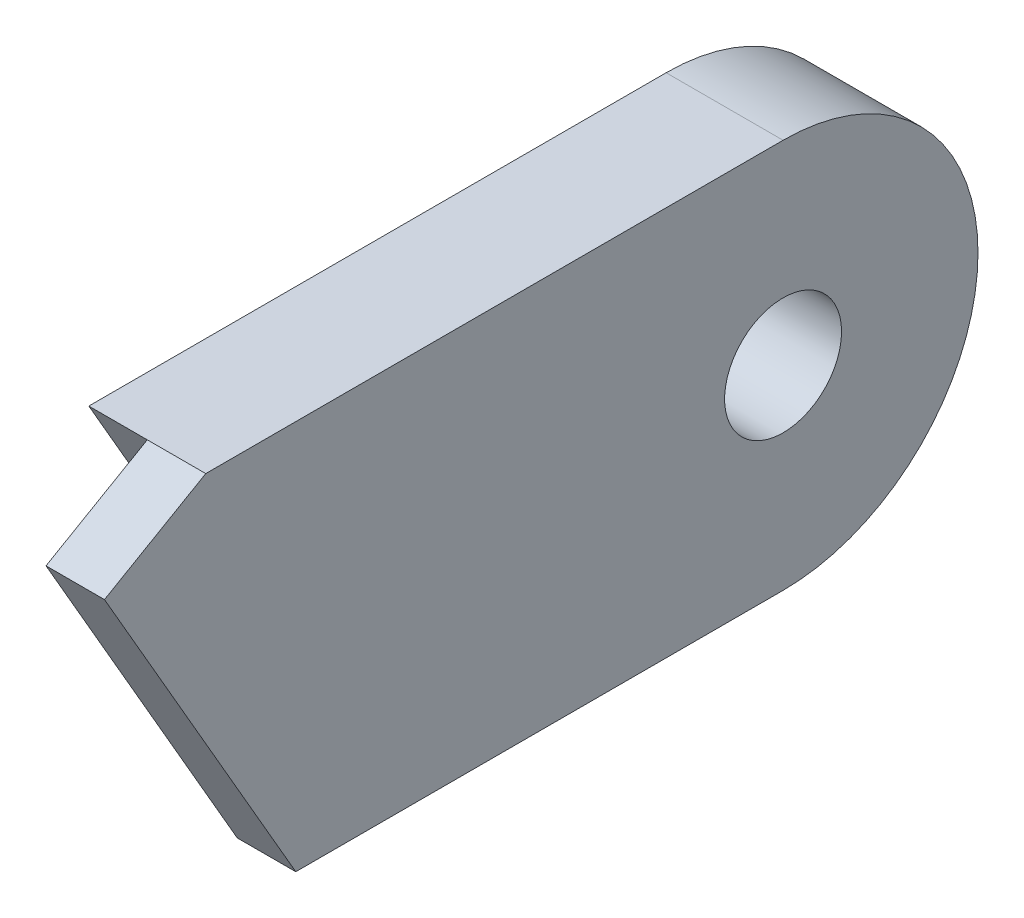
ISO-10303-21;
HEADER;
FILE_DESCRIPTION(('STEP AP214'),'2;1');
FILE_NAME('part.step','',(''),(''),'','','');
FILE_SCHEMA(('AUTOMOTIVE_DESIGN { 1 0 10303 214 1 1 1 1 }'));
ENDSEC;
DATA;
#1=APPLICATION_CONTEXT('core data for automotive mechanical design processes');
#2=APPLICATION_PROTOCOL_DEFINITION('international standard','automotive_design',2000,#1);
#3=PRODUCT_CONTEXT('',#1,'mechanical');
#4=PRODUCT('Part','Part','',(#3));
#5=PRODUCT_RELATED_PRODUCT_CATEGORY('part','',(#4));
#6=PRODUCT_DEFINITION_FORMATION('','',#4);
#7=PRODUCT_DEFINITION_CONTEXT('part definition',#1,'design');
#8=PRODUCT_DEFINITION('design','',#6,#7);
#9=PRODUCT_DEFINITION_SHAPE('','',#8);
#10=(LENGTH_UNIT() NAMED_UNIT(*) SI_UNIT(.MILLI.,.METRE.));
#11=(NAMED_UNIT(*) PLANE_ANGLE_UNIT() SI_UNIT($,.RADIAN.));
#12=(NAMED_UNIT(*) SI_UNIT($,.STERADIAN.) SOLID_ANGLE_UNIT());
#13=UNCERTAINTY_MEASURE_WITH_UNIT(LENGTH_MEASURE(1.E-05),#10,'distance_accuracy_value','');
#14=(GEOMETRIC_REPRESENTATION_CONTEXT(3) GLOBAL_UNCERTAINTY_ASSIGNED_CONTEXT((#13)) GLOBAL_UNIT_ASSIGNED_CONTEXT((#10,
#11,#12)) REPRESENTATION_CONTEXT('',''));
#15=CARTESIAN_POINT('',(0.,0.,0.));
#16=DIRECTION('',(0.,0.,1.));
#17=DIRECTION('',(1.,0.,0.));
#18=AXIS2_PLACEMENT_3D('',#15,#16,#17);
#19=CARTESIAN_POINT('',(6.,10.,-25.));
#20=DIRECTION('',(-1.,0.,0.));
#21=DIRECTION('',(0.,0.,1.));
#22=AXIS2_PLACEMENT_3D('',#19,#20,#21);
#23=PLANE('',#22);
#24=DIRECTION('',(0.,-0.866025403784436,-0.500000000000004));
#25=VECTOR('',#24,1.);
#26=CARTESIAN_POINT('',(6.,17.,9.81495457622374));
#27=LINE('',#26,#25);
#28=CARTESIAN_POINT('',(6.,17.,9.81495457622374));
#29=VERTEX_POINT('',#28);
#30=CARTESIAN_POINT('',(6.,0.,0.));
#31=VERTEX_POINT('',#30);
#32=EDGE_CURVE('E115',#29,#31,#27,.T.);
#33=ORIENTED_EDGE('',*,*,#32,.T.);
#34=DIRECTION('',(0.,0.,-1.));
#35=VECTOR('',#34,1.);
#36=CARTESIAN_POINT('',(6.,0.,-25.));
#37=LINE('',#36,#35);
#38=CARTESIAN_POINT('',(6.,0.,-25.));
#39=VERTEX_POINT('',#38);
#40=EDGE_CURVE('E81',#31,#39,#37,.T.);
#41=ORIENTED_EDGE('',*,*,#40,.T.);
#42=CARTESIAN_POINT('',(6.,10.,-25.));
#43=DIRECTION('',(1.,0.,0.));
#44=DIRECTION('',(0.,0.,1.));
#45=AXIS2_PLACEMENT_3D('',#42,#43,#44);
#46=CIRCLE('',#45,10.);
#47=CARTESIAN_POINT('',(6.,20.,-25.));
#48=VERTEX_POINT('',#47);
#49=EDGE_CURVE('E88',#39,#48,#46,.T.);
#50=ORIENTED_EDGE('',*,*,#49,.T.);
#51=DIRECTION('',(0.,0.,1.));
#52=VECTOR('',#51,1.);
#53=CARTESIAN_POINT('',(6.,20.,4.61880215351711));
#54=LINE('',#53,#52);
#55=CARTESIAN_POINT('',(6.,20.,4.61880215351711));
#56=VERTEX_POINT('',#55);
#57=EDGE_CURVE('E91',#48,#56,#54,.T.);
#58=ORIENTED_EDGE('',*,*,#57,.T.);
#59=DIRECTION('',(0.,-0.500000000000003,0.866025403784437));
#60=VECTOR('',#59,1.);
#61=CARTESIAN_POINT('',(6.,20.,4.61880215351711));
#62=LINE('',#61,#60);
#63=EDGE_CURVE('E57',#56,#29,#62,.T.);
#64=ORIENTED_EDGE('',*,*,#63,.T.);
#65=EDGE_LOOP('',(#33,#41,#50,#58,#64));
#66=FACE_BOUND('',#65,.T.);
#67=CARTESIAN_POINT('',(6.,10.,-25.));
#68=DIRECTION('',(1.,0.,0.));
#69=DIRECTION('',(0.,0.,-1.));
#70=AXIS2_PLACEMENT_3D('',#67,#68,#69);
#71=CIRCLE('',#70,3.);
#72=CARTESIAN_POINT('',(6.,10.,-28.));
#73=VERTEX_POINT('',#72);
#74=EDGE_CURVE('E111',#73,#73,#71,.T.);
#75=ORIENTED_EDGE('',*,*,#74,.F.);
#76=EDGE_LOOP('',(#75));
#77=FACE_BOUND('',#76,.T.);
#78=ADVANCED_FACE('F33',(#66,#77),#23,.F.);
#79=CARTESIAN_POINT('',(0.,10.,-25.));
#80=DIRECTION('',(-1.,0.,0.));
#81=DIRECTION('',(0.,0.,1.));
#82=AXIS2_PLACEMENT_3D('',#79,#80,#81);
#83=PLANE('',#82);
#84=DIRECTION('',(0.,-0.866025403784436,-0.500000000000004));
#85=VECTOR('',#84,1.);
#86=CARTESIAN_POINT('',(0.,20.,4.61880215351711));
#87=LINE('',#86,#85);
#88=CARTESIAN_POINT('',(0.,20.,4.61880215351711));
#89=VERTEX_POINT('',#88);
#90=CARTESIAN_POINT('',(0.,0.,-6.92820323027553));
#91=VERTEX_POINT('',#90);
#92=EDGE_CURVE('E125',#89,#91,#87,.T.);
#93=ORIENTED_EDGE('',*,*,#92,.F.);
#94=DIRECTION('',(0.,0.,1.));
#95=VECTOR('',#94,1.);
#96=CARTESIAN_POINT('',(0.,20.,4.61880215351711));
#97=LINE('',#96,#95);
#98=CARTESIAN_POINT('',(0.,20.,-25.));
#99=VERTEX_POINT('',#98);
#100=EDGE_CURVE('E113',#99,#89,#97,.T.);
#101=ORIENTED_EDGE('',*,*,#100,.F.);
#102=CARTESIAN_POINT('',(0.,10.,-25.));
#103=DIRECTION('',(1.,0.,0.));
#104=DIRECTION('',(0.,0.,1.));
#105=AXIS2_PLACEMENT_3D('',#102,#103,#104);
#106=CIRCLE('',#105,10.);
#107=CARTESIAN_POINT('',(0.,0.,-25.));
#108=VERTEX_POINT('',#107);
#109=EDGE_CURVE('E73',#108,#99,#106,.T.);
#110=ORIENTED_EDGE('',*,*,#109,.F.);
#111=DIRECTION('',(0.,0.,-1.));
#112=VECTOR('',#111,1.);
#113=CARTESIAN_POINT('',(0.,0.,-25.));
#114=LINE('',#113,#112);
#115=EDGE_CURVE('E109',#91,#108,#114,.T.);
#116=ORIENTED_EDGE('',*,*,#115,.F.);
#117=EDGE_LOOP('',(#93,#101,#110,#116));
#118=FACE_BOUND('',#117,.T.);
#119=CARTESIAN_POINT('',(0.,10.,-25.));
#120=DIRECTION('',(1.,0.,0.));
#121=DIRECTION('',(0.,0.,-1.));
#122=AXIS2_PLACEMENT_3D('',#119,#120,#121);
#123=CIRCLE('',#122,3.);
#124=CARTESIAN_POINT('',(0.,10.,-28.));
#125=VERTEX_POINT('',#124);
#126=EDGE_CURVE('E153',#125,#125,#123,.T.);
#127=ORIENTED_EDGE('',*,*,#126,.T.);
#128=EDGE_LOOP('',(#127));
#129=FACE_BOUND('',#128,.T.);
#130=ADVANCED_FACE('F121',(#118,#129),#83,.T.);
#131=CARTESIAN_POINT('',(6.,17.,9.81495457622374));
#132=DIRECTION('',(0.,0.500000000000004,-0.866025403784436));
#133=DIRECTION('',(0.,0.866025403784436,0.500000000000004));
#134=AXIS2_PLACEMENT_3D('',#131,#132,#133);
#135=PLANE('',#134);
#136=DIRECTION('',(-1.,0.,0.));
#137=VECTOR('',#136,1.);
#138=CARTESIAN_POINT('',(6.,17.,9.81495457622374));
#139=LINE('',#138,#137);
#140=CARTESIAN_POINT('',(3.,17.,9.81495457622374));
#141=VERTEX_POINT('',#140);
#142=EDGE_CURVE('E105',#29,#141,#139,.T.);
#143=ORIENTED_EDGE('',*,*,#142,.T.);
#144=DIRECTION('',(0.,0.866025403784436,0.500000000000004));
#145=VECTOR('',#144,1.);
#146=CARTESIAN_POINT('',(3.,17.,9.81495457622373));
#147=LINE('',#146,#145);
#148=CARTESIAN_POINT('',(3.,0.,0.));
#149=VERTEX_POINT('',#148);
#150=EDGE_CURVE('E48',#149,#141,#147,.T.);
#151=ORIENTED_EDGE('',*,*,#150,.F.);
#152=DIRECTION('',(-1.,0.,0.));
#153=VECTOR('',#152,1.);
#154=CARTESIAN_POINT('',(6.,0.,0.));
#155=LINE('',#154,#153);
#156=EDGE_CURVE('E11',#31,#149,#155,.T.);
#157=ORIENTED_EDGE('',*,*,#156,.F.);
#158=ORIENTED_EDGE('',*,*,#32,.F.);
#159=EDGE_LOOP('',(#143,#151,#157,#158));
#160=FACE_BOUND('',#159,.T.);
#161=ADVANCED_FACE('F35',(#160),#135,.F.);
#162=CARTESIAN_POINT('',(6.,0.,-25.));
#163=DIRECTION('',(0.,1.,0.));
#164=DIRECTION('',(0.,0.,1.));
#165=AXIS2_PLACEMENT_3D('',#162,#163,#164);
#166=PLANE('',#165);
#167=DIRECTION('',(0.,0.,1.));
#168=VECTOR('',#167,1.);
#169=CARTESIAN_POINT('',(3.,0.,0.));
#170=LINE('',#169,#168);
#171=CARTESIAN_POINT('',(3.,0.,-6.92820323027553));
#172=VERTEX_POINT('',#171);
#173=EDGE_CURVE('E142',#172,#149,#170,.T.);
#174=ORIENTED_EDGE('',*,*,#173,.F.);
#175=DIRECTION('',(-1.,0.,0.));
#176=VECTOR('',#175,1.);
#177=CARTESIAN_POINT('',(3.,0.,-6.92820323027553));
#178=LINE('',#177,#176);
#179=EDGE_CURVE('E140',#172,#91,#178,.T.);
#180=ORIENTED_EDGE('',*,*,#179,.T.);
#181=ORIENTED_EDGE('',*,*,#115,.T.);
#182=DIRECTION('',(-1.,0.,0.));
#183=VECTOR('',#182,1.);
#184=CARTESIAN_POINT('',(6.,0.,-25.));
#185=LINE('',#184,#183);
#186=EDGE_CURVE('E41',#39,#108,#185,.T.);
#187=ORIENTED_EDGE('',*,*,#186,.F.);
#188=ORIENTED_EDGE('',*,*,#40,.F.);
#189=ORIENTED_EDGE('',*,*,#156,.T.);
#190=EDGE_LOOP('',(#174,#180,#181,#187,#188,#189));
#191=FACE_BOUND('',#190,.T.);
#192=ADVANCED_FACE('F162',(#191),#166,.F.);
#193=CARTESIAN_POINT('',(6.,10.,-25.));
#194=DIRECTION('',(-1.,0.,0.));
#195=DIRECTION('',(0.,0.,1.));
#196=AXIS2_PLACEMENT_3D('',#193,#194,#195);
#197=CYLINDRICAL_SURFACE('',#196,10.);
#198=ORIENTED_EDGE('',*,*,#109,.T.);
#199=DIRECTION('',(-1.,0.,0.));
#200=VECTOR('',#199,1.);
#201=CARTESIAN_POINT('',(6.,20.,-25.));
#202=LINE('',#201,#200);
#203=EDGE_CURVE('E94',#48,#99,#202,.T.);
#204=ORIENTED_EDGE('',*,*,#203,.F.);
#205=ORIENTED_EDGE('',*,*,#49,.F.);
#206=ORIENTED_EDGE('',*,*,#186,.T.);
#207=EDGE_LOOP('',(#198,#204,#205,#206));
#208=FACE_BOUND('',#207,.T.);
#209=ADVANCED_FACE('F95',(#208),#197,.T.);
#210=CARTESIAN_POINT('',(6.,20.,4.61880215351711));
#211=DIRECTION('',(0.,-1.,0.));
#212=DIRECTION('',(0.,0.,-1.));
#213=AXIS2_PLACEMENT_3D('',#210,#211,#212);
#214=PLANE('',#213);
#215=ORIENTED_EDGE('',*,*,#100,.T.);
#216=DIRECTION('',(-1.,0.,0.));
#217=VECTOR('',#216,1.);
#218=CARTESIAN_POINT('',(3.,20.,4.61880215351711));
#219=LINE('',#218,#217);
#220=CARTESIAN_POINT('',(3.,20.,4.61880215351711));
#221=VERTEX_POINT('',#220);
#222=EDGE_CURVE('E128',#221,#89,#219,.T.);
#223=ORIENTED_EDGE('',*,*,#222,.F.);
#224=DIRECTION('',(-1.,0.,0.));
#225=VECTOR('',#224,1.);
#226=CARTESIAN_POINT('',(6.,20.,4.61880215351711));
#227=LINE('',#226,#225);
#228=EDGE_CURVE('E99',#56,#221,#227,.T.);
#229=ORIENTED_EDGE('',*,*,#228,.F.);
#230=ORIENTED_EDGE('',*,*,#57,.F.);
#231=ORIENTED_EDGE('',*,*,#203,.T.);
#232=EDGE_LOOP('',(#215,#223,#229,#230,#231));
#233=FACE_BOUND('',#232,.T.);
#234=ADVANCED_FACE('F101',(#233),#214,.F.);
#235=CARTESIAN_POINT('',(6.,20.,4.61880215351711));
#236=DIRECTION('',(0.,-0.866025403784437,-0.500000000000003));
#237=DIRECTION('',(0.,0.500000000000003,-0.866025403784437));
#238=AXIS2_PLACEMENT_3D('',#235,#236,#237);
#239=PLANE('',#238);
#240=ORIENTED_EDGE('',*,*,#228,.T.);
#241=DIRECTION('',(0.,0.500000000000004,-0.866025403784436));
#242=VECTOR('',#241,1.);
#243=CARTESIAN_POINT('',(3.,17.,9.81495457622373));
#244=LINE('',#243,#242);
#245=EDGE_CURVE('E143',#141,#221,#244,.T.);
#246=ORIENTED_EDGE('',*,*,#245,.F.);
#247=ORIENTED_EDGE('',*,*,#142,.F.);
#248=ORIENTED_EDGE('',*,*,#63,.F.);
#249=EDGE_LOOP('',(#240,#246,#247,#248));
#250=FACE_BOUND('',#249,.T.);
#251=ADVANCED_FACE('F179',(#250),#239,.F.);
#252=CARTESIAN_POINT('',(6.,10.,-25.));
#253=DIRECTION('',(-1.,0.,0.));
#254=DIRECTION('',(0.,0.,1.));
#255=AXIS2_PLACEMENT_3D('',#252,#253,#254);
#256=CYLINDRICAL_SURFACE('',#255,3.);
#257=ORIENTED_EDGE('',*,*,#74,.T.);
#258=EDGE_LOOP('',(#257));
#259=FACE_BOUND('',#258,.T.);
#260=ORIENTED_EDGE('',*,*,#126,.F.);
#261=EDGE_LOOP('',(#260));
#262=FACE_BOUND('',#261,.T.);
#263=ADVANCED_FACE('F176',(#259,#262),#256,.F.);
#264=CARTESIAN_POINT('',(3.,20.,4.61880215351711));
#265=DIRECTION('',(0.,0.500000000000004,-0.866025403784436));
#266=DIRECTION('',(0.,0.866025403784436,0.500000000000004));
#267=AXIS2_PLACEMENT_3D('',#264,#265,#266);
#268=PLANE('',#267);
#269=ORIENTED_EDGE('',*,*,#92,.T.);
#270=ORIENTED_EDGE('',*,*,#179,.F.);
#271=DIRECTION('',(0.,-0.866025403784436,-0.500000000000004));
#272=VECTOR('',#271,1.);
#273=CARTESIAN_POINT('',(3.,20.,4.61880215351711));
#274=LINE('',#273,#272);
#275=EDGE_CURVE('E137',#221,#172,#274,.T.);
#276=ORIENTED_EDGE('',*,*,#275,.F.);
#277=ORIENTED_EDGE('',*,*,#222,.T.);
#278=EDGE_LOOP('',(#269,#270,#276,#277));
#279=FACE_BOUND('',#278,.T.);
#280=ADVANCED_FACE('F138',(#279),#268,.F.);
#281=CARTESIAN_POINT('',(3.,0.,0.));
#282=DIRECTION('',(1.,0.,0.));
#283=DIRECTION('',(0.,0.,-1.));
#284=AXIS2_PLACEMENT_3D('',#281,#282,#283);
#285=PLANE('',#284);
#286=ORIENTED_EDGE('',*,*,#150,.T.);
#287=ORIENTED_EDGE('',*,*,#245,.T.);
#288=ORIENTED_EDGE('',*,*,#275,.T.);
#289=ORIENTED_EDGE('',*,*,#173,.T.);
#290=EDGE_LOOP('',(#286,#287,#288,#289));
#291=FACE_BOUND('',#290,.T.);
#292=ADVANCED_FACE('F145',(#291),#285,.F.);
#293=CLOSED_SHELL('',(#78,#130,#161,#192,#209,#234,#251,#263,#280,#292));
#294=MANIFOLD_SOLID_BREP('B2',#293);
#295=ADVANCED_BREP_SHAPE_REPRESENTATION('',(#18,#294),#14);
#296=SHAPE_DEFINITION_REPRESENTATION(#9,#295);
ENDSEC;
END-ISO-10303-21;
